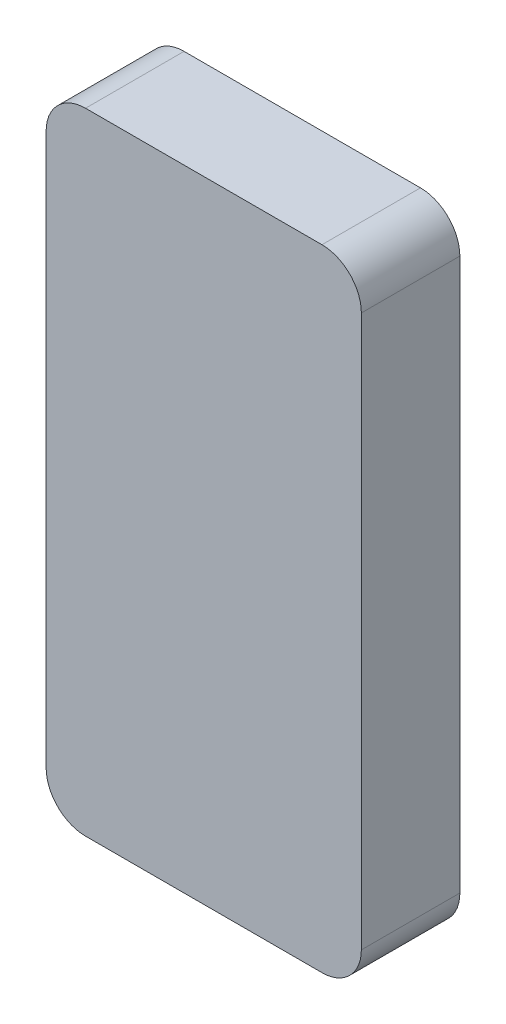
ISO-10303-21;
HEADER;
FILE_DESCRIPTION(('STEP AP214'),'2;1');
FILE_NAME('part.step','',(''),(''),'','','');
FILE_SCHEMA(('AUTOMOTIVE_DESIGN { 1 0 10303 214 1 1 1 1 }'));
ENDSEC;
DATA;
#1=APPLICATION_CONTEXT('core data for automotive mechanical design processes');
#2=APPLICATION_PROTOCOL_DEFINITION('international standard','automotive_design',2000,#1);
#3=PRODUCT_CONTEXT('',#1,'mechanical');
#4=PRODUCT('Part','Part','',(#3));
#5=PRODUCT_RELATED_PRODUCT_CATEGORY('part','',(#4));
#6=PRODUCT_DEFINITION_FORMATION('','',#4);
#7=PRODUCT_DEFINITION_CONTEXT('part definition',#1,'design');
#8=PRODUCT_DEFINITION('design','',#6,#7);
#9=PRODUCT_DEFINITION_SHAPE('','',#8);
#10=(LENGTH_UNIT() NAMED_UNIT(*) SI_UNIT(.MILLI.,.METRE.));
#11=(NAMED_UNIT(*) PLANE_ANGLE_UNIT() SI_UNIT($,.RADIAN.));
#12=(NAMED_UNIT(*) SI_UNIT($,.STERADIAN.) SOLID_ANGLE_UNIT());
#13=UNCERTAINTY_MEASURE_WITH_UNIT(LENGTH_MEASURE(1.E-05),#10,'distance_accuracy_value','');
#14=(GEOMETRIC_REPRESENTATION_CONTEXT(3) GLOBAL_UNCERTAINTY_ASSIGNED_CONTEXT((#13)) GLOBAL_UNIT_ASSIGNED_CONTEXT((#10,
#11,#12)) REPRESENTATION_CONTEXT('',''));
#15=CARTESIAN_POINT('',(0.,0.,0.));
#16=DIRECTION('',(0.,0.,1.));
#17=DIRECTION('',(1.,0.,0.));
#18=AXIS2_PLACEMENT_3D('',#15,#16,#17);
#19=CARTESIAN_POINT('',(30.,-70.,25.));
#20=DIRECTION('',(0.,0.,-1.));
#21=DIRECTION('',(-1.,0.,0.));
#22=AXIS2_PLACEMENT_3D('',#19,#20,#21);
#23=CYLINDRICAL_SURFACE('',#22,10.);
#24=CARTESIAN_POINT('',(30.,-70.,0.));
#25=DIRECTION('',(0.,0.,1.));
#26=DIRECTION('',(1.,0.,0.));
#27=AXIS2_PLACEMENT_3D('',#24,#25,#26);
#28=CIRCLE('',#27,10.);
#29=CARTESIAN_POINT('',(29.9999999999999,-80.,0.));
#30=VERTEX_POINT('',#29);
#31=CARTESIAN_POINT('',(40.,-69.9999999999999,0.));
#32=VERTEX_POINT('',#31);
#33=EDGE_CURVE('E130',#30,#32,#28,.T.);
#34=ORIENTED_EDGE('',*,*,#33,.T.);
#35=DIRECTION('',(0.,0.,-1.));
#36=VECTOR('',#35,1.);
#37=CARTESIAN_POINT('',(40.,-69.9999999999999,25.));
#38=LINE('',#37,#36);
#39=CARTESIAN_POINT('',(40.,-69.9999999999999,25.));
#40=VERTEX_POINT('',#39);
#41=EDGE_CURVE('E11',#40,#32,#38,.T.);
#42=ORIENTED_EDGE('',*,*,#41,.F.);
#43=CARTESIAN_POINT('',(30.,-70.,25.));
#44=DIRECTION('',(0.,0.,1.));
#45=DIRECTION('',(1.,0.,0.));
#46=AXIS2_PLACEMENT_3D('',#43,#44,#45);
#47=CIRCLE('',#46,10.);
#48=CARTESIAN_POINT('',(29.9999999999999,-80.,25.));
#49=VERTEX_POINT('',#48);
#50=EDGE_CURVE('E144',#49,#40,#47,.T.);
#51=ORIENTED_EDGE('',*,*,#50,.F.);
#52=DIRECTION('',(0.,0.,-1.));
#53=VECTOR('',#52,1.);
#54=CARTESIAN_POINT('',(29.9999999999999,-80.,25.));
#55=LINE('',#54,#53);
#56=EDGE_CURVE('E126',#49,#30,#55,.T.);
#57=ORIENTED_EDGE('',*,*,#56,.T.);
#58=EDGE_LOOP('',(#34,#42,#51,#57));
#59=FACE_BOUND('',#58,.T.);
#60=ADVANCED_FACE('F34',(#59),#23,.T.);
#61=CARTESIAN_POINT('',(40.,-69.9999999999999,25.));
#62=DIRECTION('',(-1.,0.,0.));
#63=DIRECTION('',(0.,0.,1.));
#64=AXIS2_PLACEMENT_3D('',#61,#62,#63);
#65=PLANE('',#64);
#66=DIRECTION('',(0.,1.,0.));
#67=VECTOR('',#66,1.);
#68=CARTESIAN_POINT('',(40.,-69.9999999999999,0.));
#69=LINE('',#68,#67);
#70=CARTESIAN_POINT('',(40.,69.9999999999999,0.));
#71=VERTEX_POINT('',#70);
#72=EDGE_CURVE('E133',#32,#71,#69,.T.);
#73=ORIENTED_EDGE('',*,*,#72,.T.);
#74=DIRECTION('',(0.,0.,-1.));
#75=VECTOR('',#74,1.);
#76=CARTESIAN_POINT('',(40.,69.9999999999999,25.));
#77=LINE('',#76,#75);
#78=CARTESIAN_POINT('',(40.,69.9999999999999,25.));
#79=VERTEX_POINT('',#78);
#80=EDGE_CURVE('E42',#79,#71,#77,.T.);
#81=ORIENTED_EDGE('',*,*,#80,.F.);
#82=DIRECTION('',(0.,1.,0.));
#83=VECTOR('',#82,1.);
#84=CARTESIAN_POINT('',(40.,-69.9999999999999,25.));
#85=LINE('',#84,#83);
#86=EDGE_CURVE('E93',#40,#79,#85,.T.);
#87=ORIENTED_EDGE('',*,*,#86,.F.);
#88=ORIENTED_EDGE('',*,*,#41,.T.);
#89=EDGE_LOOP('',(#73,#81,#87,#88));
#90=FACE_BOUND('',#89,.T.);
#91=ADVANCED_FACE('F179',(#90),#65,.F.);
#92=CARTESIAN_POINT('',(30.,70.,25.));
#93=DIRECTION('',(0.,0.,-1.));
#94=DIRECTION('',(-1.,0.,0.));
#95=AXIS2_PLACEMENT_3D('',#92,#93,#94);
#96=CYLINDRICAL_SURFACE('',#95,10.);
#97=CARTESIAN_POINT('',(30.,70.,0.));
#98=DIRECTION('',(0.,0.,1.));
#99=DIRECTION('',(-1.,0.,0.));
#100=AXIS2_PLACEMENT_3D('',#97,#98,#99);
#101=CIRCLE('',#100,10.);
#102=CARTESIAN_POINT('',(29.9999999999999,80.,0.));
#103=VERTEX_POINT('',#102);
#104=EDGE_CURVE('E135',#71,#103,#101,.T.);
#105=ORIENTED_EDGE('',*,*,#104,.T.);
#106=DIRECTION('',(0.,0.,-1.));
#107=VECTOR('',#106,1.);
#108=CARTESIAN_POINT('',(29.9999999999999,80.,25.));
#109=LINE('',#108,#107);
#110=CARTESIAN_POINT('',(29.9999999999999,80.,25.));
#111=VERTEX_POINT('',#110);
#112=EDGE_CURVE('E151',#111,#103,#109,.T.);
#113=ORIENTED_EDGE('',*,*,#112,.F.);
#114=CARTESIAN_POINT('',(30.,70.,25.));
#115=DIRECTION('',(0.,0.,1.));
#116=DIRECTION('',(-1.,0.,0.));
#117=AXIS2_PLACEMENT_3D('',#114,#115,#116);
#118=CIRCLE('',#117,10.);
#119=EDGE_CURVE('E159',#79,#111,#118,.T.);
#120=ORIENTED_EDGE('',*,*,#119,.F.);
#121=ORIENTED_EDGE('',*,*,#80,.T.);
#122=EDGE_LOOP('',(#105,#113,#120,#121));
#123=FACE_BOUND('',#122,.T.);
#124=ADVANCED_FACE('F157',(#123),#96,.T.);
#125=CARTESIAN_POINT('',(-29.9999999999999,80.,25.));
#126=DIRECTION('',(0.,-1.,0.));
#127=DIRECTION('',(0.,0.,-1.));
#128=AXIS2_PLACEMENT_3D('',#125,#126,#127);
#129=PLANE('',#128);
#130=DIRECTION('',(-1.,0.,0.));
#131=VECTOR('',#130,1.);
#132=CARTESIAN_POINT('',(-29.9999999999999,80.,0.));
#133=LINE('',#132,#131);
#134=CARTESIAN_POINT('',(-29.9999999999999,80.,0.));
#135=VERTEX_POINT('',#134);
#136=EDGE_CURVE('E137',#103,#135,#133,.T.);
#137=ORIENTED_EDGE('',*,*,#136,.T.);
#138=DIRECTION('',(0.,0.,-1.));
#139=VECTOR('',#138,1.);
#140=CARTESIAN_POINT('',(-29.9999999999999,80.,25.));
#141=LINE('',#140,#139);
#142=CARTESIAN_POINT('',(-29.9999999999999,80.,25.));
#143=VERTEX_POINT('',#142);
#144=EDGE_CURVE('E148',#143,#135,#141,.T.);
#145=ORIENTED_EDGE('',*,*,#144,.F.);
#146=DIRECTION('',(-1.,0.,0.));
#147=VECTOR('',#146,1.);
#148=CARTESIAN_POINT('',(-29.9999999999999,80.,25.));
#149=LINE('',#148,#147);
#150=EDGE_CURVE('E171',#111,#143,#149,.T.);
#151=ORIENTED_EDGE('',*,*,#150,.F.);
#152=ORIENTED_EDGE('',*,*,#112,.T.);
#153=EDGE_LOOP('',(#137,#145,#151,#152));
#154=FACE_BOUND('',#153,.T.);
#155=ADVANCED_FACE('F167',(#154),#129,.F.);
#156=CARTESIAN_POINT('',(-30.,70.,25.));
#157=DIRECTION('',(0.,0.,-1.));
#158=DIRECTION('',(-1.,0.,0.));
#159=AXIS2_PLACEMENT_3D('',#156,#157,#158);
#160=CYLINDRICAL_SURFACE('',#159,10.);
#161=CARTESIAN_POINT('',(-30.,70.,0.));
#162=DIRECTION('',(0.,0.,1.));
#163=DIRECTION('',(-1.,0.,0.));
#164=AXIS2_PLACEMENT_3D('',#161,#162,#163);
#165=CIRCLE('',#164,10.);
#166=CARTESIAN_POINT('',(-40.,69.9999999999999,0.));
#167=VERTEX_POINT('',#166);
#168=EDGE_CURVE('E139',#135,#167,#165,.T.);
#169=ORIENTED_EDGE('',*,*,#168,.T.);
#170=DIRECTION('',(0.,0.,-1.));
#171=VECTOR('',#170,1.);
#172=CARTESIAN_POINT('',(-40.,69.9999999999999,25.));
#173=LINE('',#172,#171);
#174=CARTESIAN_POINT('',(-40.,69.9999999999999,25.));
#175=VERTEX_POINT('',#174);
#176=EDGE_CURVE('E121',#175,#167,#173,.T.);
#177=ORIENTED_EDGE('',*,*,#176,.F.);
#178=CARTESIAN_POINT('',(-30.,70.,25.));
#179=DIRECTION('',(0.,0.,1.));
#180=DIRECTION('',(-1.,0.,0.));
#181=AXIS2_PLACEMENT_3D('',#178,#179,#180);
#182=CIRCLE('',#181,10.);
#183=EDGE_CURVE('E112',#143,#175,#182,.T.);
#184=ORIENTED_EDGE('',*,*,#183,.F.);
#185=ORIENTED_EDGE('',*,*,#144,.T.);
#186=EDGE_LOOP('',(#169,#177,#184,#185));
#187=FACE_BOUND('',#186,.T.);
#188=ADVANCED_FACE('F170',(#187),#160,.T.);
#189=CARTESIAN_POINT('',(-40.,-69.9999999999999,25.));
#190=DIRECTION('',(1.,0.,0.));
#191=DIRECTION('',(0.,0.,-1.));
#192=AXIS2_PLACEMENT_3D('',#189,#190,#191);
#193=PLANE('',#192);
#194=DIRECTION('',(0.,-1.,0.));
#195=VECTOR('',#194,1.);
#196=CARTESIAN_POINT('',(-40.,-69.9999999999999,0.));
#197=LINE('',#196,#195);
#198=CARTESIAN_POINT('',(-40.,-70.,0.));
#199=VERTEX_POINT('',#198);
#200=EDGE_CURVE('E120',#167,#199,#197,.T.);
#201=ORIENTED_EDGE('',*,*,#200,.T.);
#202=DIRECTION('',(0.,0.,-1.));
#203=VECTOR('',#202,1.);
#204=CARTESIAN_POINT('',(-40.,-70.,25.));
#205=LINE('',#204,#203);
#206=CARTESIAN_POINT('',(-40.,-70.,25.));
#207=VERTEX_POINT('',#206);
#208=EDGE_CURVE('E117',#207,#199,#205,.T.);
#209=ORIENTED_EDGE('',*,*,#208,.F.);
#210=DIRECTION('',(0.,-1.,0.));
#211=VECTOR('',#210,1.);
#212=CARTESIAN_POINT('',(-40.,-69.9999999999999,25.));
#213=LINE('',#212,#211);
#214=EDGE_CURVE('E106',#175,#207,#213,.T.);
#215=ORIENTED_EDGE('',*,*,#214,.F.);
#216=ORIENTED_EDGE('',*,*,#176,.T.);
#217=EDGE_LOOP('',(#201,#209,#215,#216));
#218=FACE_BOUND('',#217,.T.);
#219=ADVANCED_FACE('F118',(#218),#193,.F.);
#220=CARTESIAN_POINT('',(-30.,-70.,25.));
#221=DIRECTION('',(0.,0.,-1.));
#222=DIRECTION('',(-1.,0.,0.));
#223=AXIS2_PLACEMENT_3D('',#220,#221,#222);
#224=CYLINDRICAL_SURFACE('',#223,10.);
#225=CARTESIAN_POINT('',(-30.,-70.,0.));
#226=DIRECTION('',(0.,0.,1.));
#227=DIRECTION('',(-1.,0.,0.));
#228=AXIS2_PLACEMENT_3D('',#225,#226,#227);
#229=CIRCLE('',#228,10.);
#230=CARTESIAN_POINT('',(-29.9999999999999,-80.,0.));
#231=VERTEX_POINT('',#230);
#232=EDGE_CURVE('E79',#199,#231,#229,.T.);
#233=ORIENTED_EDGE('',*,*,#232,.T.);
#234=DIRECTION('',(0.,0.,-1.));
#235=VECTOR('',#234,1.);
#236=CARTESIAN_POINT('',(-29.9999999999999,-80.,25.));
#237=LINE('',#236,#235);
#238=CARTESIAN_POINT('',(-29.9999999999999,-80.,25.));
#239=VERTEX_POINT('',#238);
#240=EDGE_CURVE('E122',#239,#231,#237,.T.);
#241=ORIENTED_EDGE('',*,*,#240,.F.);
#242=CARTESIAN_POINT('',(-30.,-70.,25.));
#243=DIRECTION('',(0.,0.,1.));
#244=DIRECTION('',(-1.,0.,0.));
#245=AXIS2_PLACEMENT_3D('',#242,#243,#244);
#246=CIRCLE('',#245,10.);
#247=EDGE_CURVE('E110',#207,#239,#246,.T.);
#248=ORIENTED_EDGE('',*,*,#247,.F.);
#249=ORIENTED_EDGE('',*,*,#208,.T.);
#250=EDGE_LOOP('',(#233,#241,#248,#249));
#251=FACE_BOUND('',#250,.T.);
#252=ADVANCED_FACE('F124',(#251),#224,.T.);
#253=CARTESIAN_POINT('',(-29.9999999999999,-80.,25.));
#254=DIRECTION('',(0.,1.,0.));
#255=DIRECTION('',(0.,0.,1.));
#256=AXIS2_PLACEMENT_3D('',#253,#254,#255);
#257=PLANE('',#256);
#258=DIRECTION('',(1.,0.,0.));
#259=VECTOR('',#258,1.);
#260=CARTESIAN_POINT('',(-29.9999999999999,-80.,0.));
#261=LINE('',#260,#259);
#262=EDGE_CURVE('E85',#231,#30,#261,.T.);
#263=ORIENTED_EDGE('',*,*,#262,.T.);
#264=ORIENTED_EDGE('',*,*,#56,.F.);
#265=DIRECTION('',(1.,0.,0.));
#266=VECTOR('',#265,1.);
#267=CARTESIAN_POINT('',(-29.9999999999999,-80.,25.));
#268=LINE('',#267,#266);
#269=EDGE_CURVE('E50',#239,#49,#268,.T.);
#270=ORIENTED_EDGE('',*,*,#269,.F.);
#271=ORIENTED_EDGE('',*,*,#240,.T.);
#272=EDGE_LOOP('',(#263,#264,#270,#271));
#273=FACE_BOUND('',#272,.T.);
#274=ADVANCED_FACE('F195',(#273),#257,.F.);
#275=CARTESIAN_POINT('',(30.,-70.,25.));
#276=DIRECTION('',(0.,0.,1.));
#277=DIRECTION('',(1.,0.,0.));
#278=AXIS2_PLACEMENT_3D('',#275,#276,#277);
#279=PLANE('',#278);
#280=ORIENTED_EDGE('',*,*,#50,.T.);
#281=ORIENTED_EDGE('',*,*,#86,.T.);
#282=ORIENTED_EDGE('',*,*,#119,.T.);
#283=ORIENTED_EDGE('',*,*,#150,.T.);
#284=ORIENTED_EDGE('',*,*,#183,.T.);
#285=ORIENTED_EDGE('',*,*,#214,.T.);
#286=ORIENTED_EDGE('',*,*,#247,.T.);
#287=ORIENTED_EDGE('',*,*,#269,.T.);
#288=EDGE_LOOP('',(#280,#281,#282,#283,#284,#285,#286,#287));
#289=FACE_BOUND('',#288,.T.);
#290=ADVANCED_FACE('F108',(#289),#279,.T.);
#291=CARTESIAN_POINT('',(30.,-70.,0.));
#292=DIRECTION('',(0.,0.,1.));
#293=DIRECTION('',(1.,0.,0.));
#294=AXIS2_PLACEMENT_3D('',#291,#292,#293);
#295=PLANE('',#294);
#296=ORIENTED_EDGE('',*,*,#33,.F.);
#297=ORIENTED_EDGE('',*,*,#262,.F.);
#298=ORIENTED_EDGE('',*,*,#232,.F.);
#299=ORIENTED_EDGE('',*,*,#200,.F.);
#300=ORIENTED_EDGE('',*,*,#168,.F.);
#301=ORIENTED_EDGE('',*,*,#136,.F.);
#302=ORIENTED_EDGE('',*,*,#104,.F.);
#303=ORIENTED_EDGE('',*,*,#72,.F.);
#304=EDGE_LOOP('',(#296,#297,#298,#299,#300,#301,#302,#303));
#305=FACE_BOUND('',#304,.T.);
#306=ADVANCED_FACE('F163',(#305),#295,.F.);
#307=CLOSED_SHELL('',(#60,#91,#124,#155,#188,#219,#252,#274,#290,#306));
#308=MANIFOLD_SOLID_BREP('B2',#307);
#309=ADVANCED_BREP_SHAPE_REPRESENTATION('',(#18,#308),#14);
#310=SHAPE_DEFINITION_REPRESENTATION(#9,#309);
ENDSEC;
END-ISO-10303-21;
